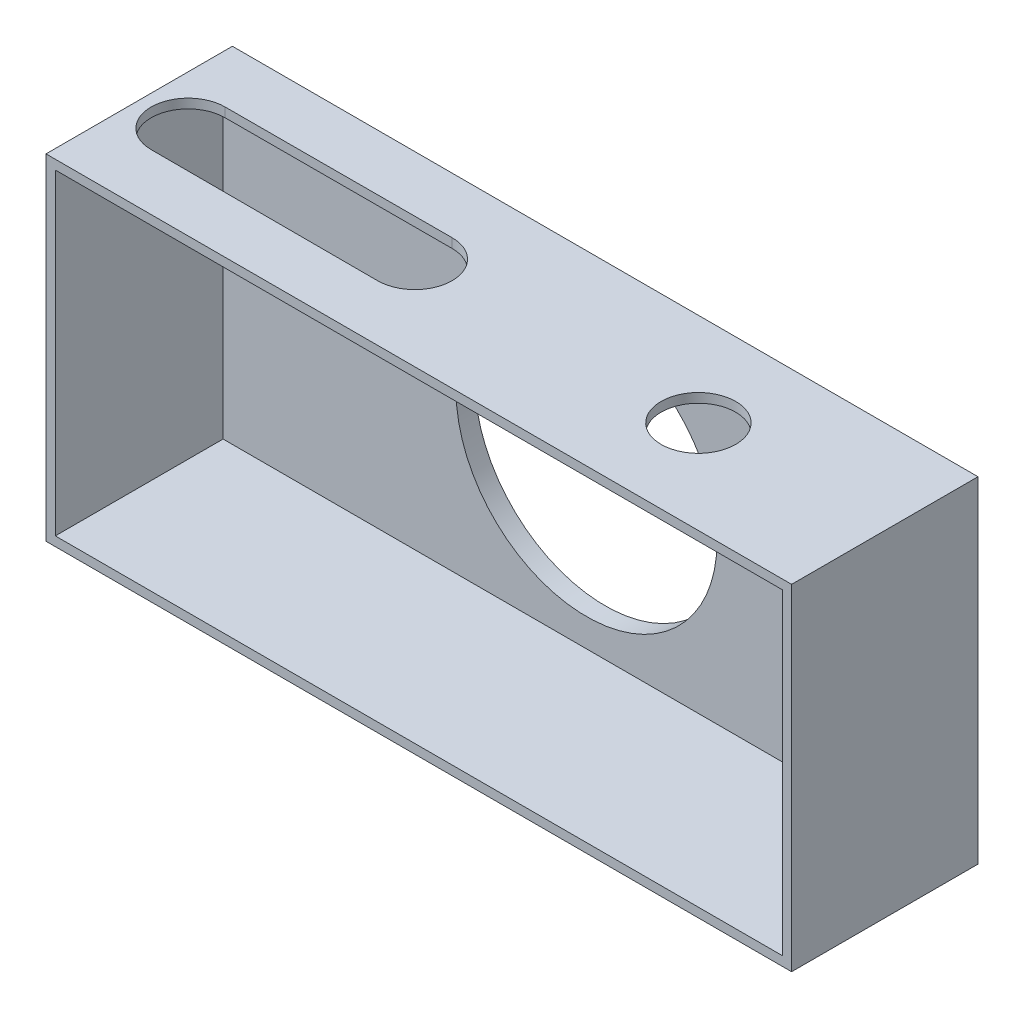
ISO-10303-21;
HEADER;
FILE_DESCRIPTION(('STEP AP214'),'2;1');
FILE_NAME('part.step','',(''),(''),'','','');
FILE_SCHEMA(('AUTOMOTIVE_DESIGN { 1 0 10303 214 1 1 1 1 }'));
ENDSEC;
DATA;
#1=APPLICATION_CONTEXT('core data for automotive mechanical design processes');
#2=APPLICATION_PROTOCOL_DEFINITION('international standard','automotive_design',2000,#1);
#3=PRODUCT_CONTEXT('',#1,'mechanical');
#4=PRODUCT('Part','Part','',(#3));
#5=PRODUCT_RELATED_PRODUCT_CATEGORY('part','',(#4));
#6=PRODUCT_DEFINITION_FORMATION('','',#4);
#7=PRODUCT_DEFINITION_CONTEXT('part definition',#1,'design');
#8=PRODUCT_DEFINITION('design','',#6,#7);
#9=PRODUCT_DEFINITION_SHAPE('','',#8);
#10=(LENGTH_UNIT() NAMED_UNIT(*) SI_UNIT(.MILLI.,.METRE.));
#11=(NAMED_UNIT(*) PLANE_ANGLE_UNIT() SI_UNIT($,.RADIAN.));
#12=(NAMED_UNIT(*) SI_UNIT($,.STERADIAN.) SOLID_ANGLE_UNIT());
#13=UNCERTAINTY_MEASURE_WITH_UNIT(LENGTH_MEASURE(1.E-05),#10,'distance_accuracy_value','');
#14=(GEOMETRIC_REPRESENTATION_CONTEXT(3) GLOBAL_UNCERTAINTY_ASSIGNED_CONTEXT((#13)) GLOBAL_UNIT_ASSIGNED_CONTEXT((#10,
#11,#12)) REPRESENTATION_CONTEXT('',''));
#15=CARTESIAN_POINT('',(0.,0.,0.));
#16=DIRECTION('',(0.,0.,1.));
#17=DIRECTION('',(1.,0.,0.));
#18=AXIS2_PLACEMENT_3D('',#15,#16,#17);
#19=CARTESIAN_POINT('',(0.,0.,127.));
#20=DIRECTION('',(0.,-1.,0.));
#21=DIRECTION('',(1.,0.,0.));
#22=AXIS2_PLACEMENT_3D('',#19,#20,#21);
#23=PLANE('',#22);
#24=DIRECTION('',(-1.,0.,0.));
#25=VECTOR('',#24,1.);
#26=CARTESIAN_POINT('',(0.,0.,0.));
#27=LINE('',#26,#25);
#28=CARTESIAN_POINT('',(0.,0.,0.));
#29=VERTEX_POINT('',#28);
#30=CARTESIAN_POINT('',(-508.,0.,0.));
#31=VERTEX_POINT('',#30);
#32=EDGE_CURVE('E232',#29,#31,#27,.T.);
#33=ORIENTED_EDGE('',*,*,#32,.T.);
#34=DIRECTION('',(0.,0.,-1.));
#35=VECTOR('',#34,1.);
#36=CARTESIAN_POINT('',(-508.,0.,127.));
#37=LINE('',#36,#35);
#38=CARTESIAN_POINT('',(-508.,0.,127.));
#39=VERTEX_POINT('',#38);
#40=EDGE_CURVE('E247',#39,#31,#37,.T.);
#41=ORIENTED_EDGE('',*,*,#40,.F.);
#42=DIRECTION('',(-1.,0.,0.));
#43=VECTOR('',#42,1.);
#44=CARTESIAN_POINT('',(0.,0.,127.));
#45=LINE('',#44,#43);
#46=CARTESIAN_POINT('',(0.,0.,127.));
#47=VERTEX_POINT('',#46);
#48=EDGE_CURVE('E218',#47,#39,#45,.T.);
#49=ORIENTED_EDGE('',*,*,#48,.F.);
#50=DIRECTION('',(0.,0.,-1.));
#51=VECTOR('',#50,1.);
#52=CARTESIAN_POINT('',(0.,0.,127.));
#53=LINE('',#52,#51);
#54=EDGE_CURVE('E251',#47,#29,#53,.T.);
#55=ORIENTED_EDGE('',*,*,#54,.T.);
#56=EDGE_LOOP('',(#33,#41,#49,#55));
#57=FACE_BOUND('',#56,.T.);
#58=CARTESIAN_POINT('',(-127.,0.,63.5));
#59=DIRECTION('',(0.,1.,0.));
#60=DIRECTION('',(0.,0.,1.));
#61=AXIS2_PLACEMENT_3D('',#58,#59,#60);
#62=CIRCLE('',#61,25.4);
#63=CARTESIAN_POINT('',(-127.,0.,88.9));
#64=VERTEX_POINT('',#63);
#65=EDGE_CURVE('E162',#64,#64,#62,.T.);
#66=ORIENTED_EDGE('',*,*,#65,.F.);
#67=EDGE_LOOP('',(#66));
#68=FACE_BOUND('',#67,.T.);
#69=DIRECTION('',(-0.999999143713304,0.,-0.00130865299402516));
#70=VECTOR('',#69,1.);
#71=CARTESIAN_POINT('',(-0.116871006548326,0.,89.3062614817129));
#72=LINE('',#71,#70);
#73=CARTESIAN_POINT('',(-320.168483958783,0.,88.887424621536));
#74=VERTEX_POINT('',#73);
#75=CARTESIAN_POINT('',(-474.665471547515,0.,88.6852415030334));
#76=VERTEX_POINT('',#75);
#77=EDGE_CURVE('E55',#74,#76,#72,.T.);
#78=ORIENTED_EDGE('',*,*,#77,.T.);
#79=CARTESIAN_POINT('',(-474.665471547515,0.,63.5));
#80=DIRECTION('',(0.,1.,0.));
#81=DIRECTION('',(0.,0.,1.));
#82=AXIS2_PLACEMENT_3D('',#79,#80,#81);
#83=CIRCLE('',#82,25.1852415030334);
#84=CARTESIAN_POINT('',(-474.665471547515,0.,38.3147584969666));
#85=VERTEX_POINT('',#84);
#86=EDGE_CURVE('E147',#85,#76,#83,.T.);
#87=ORIENTED_EDGE('',*,*,#86,.F.);
#88=DIRECTION('',(0.999999143713304,0.,-0.00130865299402512));
#89=VECTOR('',#88,1.);
#90=CARTESIAN_POINT('',(0.0493277813789354,0.,37.6935210215594));
#91=LINE('',#90,#89);
#92=CARTESIAN_POINT('',(-320.168483958783,0.,38.112575378464));
#93=VERTEX_POINT('',#92);
#94=EDGE_CURVE('E131',#85,#93,#91,.T.);
#95=ORIENTED_EDGE('',*,*,#94,.T.);
#96=CARTESIAN_POINT('',(-320.168483958783,0.,63.5));
#97=DIRECTION('',(0.,1.,0.));
#98=DIRECTION('',(0.,0.,1.));
#99=AXIS2_PLACEMENT_3D('',#96,#97,#98);
#100=CIRCLE('',#99,25.387424621536);
#101=EDGE_CURVE('E141',#74,#93,#100,.T.);
#102=ORIENTED_EDGE('',*,*,#101,.F.);
#103=EDGE_LOOP('',(#78,#87,#95,#102));
#104=FACE_BOUND('',#103,.T.);
#105=ADVANCED_FACE('F39',(#57,#68,#104),#23,.F.);
#106=CARTESIAN_POINT('',(0.,-6.34999999999999,12.7));
#107=DIRECTION('',(0.,1.,0.));
#108=DIRECTION('',(-1.,0.,0.));
#109=AXIS2_PLACEMENT_3D('',#106,#107,#108);
#110=PLANE('',#109);
#111=DIRECTION('',(-1.,0.,0.));
#112=VECTOR('',#111,1.);
#113=CARTESIAN_POINT('',(0.,-6.34999999999999,127.));
#114=LINE('',#113,#112);
#115=CARTESIAN_POINT('',(-6.35000000000002,-6.34999999999999,127.));
#116=VERTEX_POINT('',#115);
#117=CARTESIAN_POINT('',(-501.65,-6.35000000000005,127.));
#118=VERTEX_POINT('',#117);
#119=EDGE_CURVE('E190',#116,#118,#114,.T.);
#120=ORIENTED_EDGE('',*,*,#119,.T.);
#121=DIRECTION('',(0.,0.,1.));
#122=VECTOR('',#121,1.);
#123=CARTESIAN_POINT('',(-501.65,-6.35000000000005,12.7));
#124=LINE('',#123,#122);
#125=CARTESIAN_POINT('',(-501.65,-6.35000000000005,12.7));
#126=VERTEX_POINT('',#125);
#127=EDGE_CURVE('E208',#126,#118,#124,.T.);
#128=ORIENTED_EDGE('',*,*,#127,.F.);
#129=DIRECTION('',(-1.,0.,0.));
#130=VECTOR('',#129,1.);
#131=CARTESIAN_POINT('',(0.,-6.34999999999999,12.7));
#132=LINE('',#131,#130);
#133=CARTESIAN_POINT('',(-6.35000000000002,-6.34999999999999,12.7));
#134=VERTEX_POINT('',#133);
#135=EDGE_CURVE('E176',#134,#126,#132,.T.);
#136=ORIENTED_EDGE('',*,*,#135,.F.);
#137=DIRECTION('',(0.,0.,1.));
#138=VECTOR('',#137,1.);
#139=CARTESIAN_POINT('',(-6.35000000000002,-6.34999999999999,12.7));
#140=LINE('',#139,#138);
#141=EDGE_CURVE('E187',#134,#116,#140,.T.);
#142=ORIENTED_EDGE('',*,*,#141,.T.);
#143=EDGE_LOOP('',(#120,#128,#136,#142));
#144=FACE_BOUND('',#143,.T.);
#145=CARTESIAN_POINT('',(-127.,-6.35000000000002,63.5));
#146=DIRECTION('',(0.,1.,0.));
#147=DIRECTION('',(-1.,0.,0.));
#148=AXIS2_PLACEMENT_3D('',#145,#146,#147);
#149=CIRCLE('',#148,25.4);
#150=CARTESIAN_POINT('',(-152.4,-6.35000000000003,63.5));
#151=VERTEX_POINT('',#150);
#152=EDGE_CURVE('E157',#151,#151,#149,.T.);
#153=ORIENTED_EDGE('',*,*,#152,.T.);
#154=EDGE_LOOP('',(#153));
#155=FACE_BOUND('',#154,.T.);
#156=DIRECTION('',(-0.999999143713304,0.,-0.00130865299402516));
#157=VECTOR('',#156,1.);
#158=CARTESIAN_POINT('',(-0.100251127755599,-6.34999999999999,89.3062832313857));
#159=LINE('',#158,#157);
#160=CARTESIAN_POINT('',(-320.168483958783,-6.35000000000002,88.887424621536));
#161=VERTEX_POINT('',#160);
#162=CARTESIAN_POINT('',(-474.665471547515,-6.35000000000005,88.6852415030334));
#163=VERTEX_POINT('',#162);
#164=EDGE_CURVE('E11',#161,#163,#159,.T.);
#165=ORIENTED_EDGE('',*,*,#164,.F.);
#166=CARTESIAN_POINT('',(-320.168483958783,-6.35000000000002,63.5));
#167=DIRECTION('',(0.,1.,0.));
#168=DIRECTION('',(-1.,0.,0.));
#169=AXIS2_PLACEMENT_3D('',#166,#167,#168);
#170=CIRCLE('',#169,25.387424621536);
#171=CARTESIAN_POINT('',(-320.168483958783,-6.35000000000002,38.112575378464));
#172=VERTEX_POINT('',#171);
#173=EDGE_CURVE('E255',#161,#172,#170,.T.);
#174=ORIENTED_EDGE('',*,*,#173,.T.);
#175=DIRECTION('',(0.999999143713304,0.,-0.00130865299402512));
#176=VECTOR('',#175,1.);
#177=CARTESIAN_POINT('',(0.0327079025862104,-6.34999999999999,37.6935427712322));
#178=LINE('',#177,#176);
#179=CARTESIAN_POINT('',(-474.665471547515,-6.35000000000002,38.3147584969666));
#180=VERTEX_POINT('',#179);
#181=EDGE_CURVE('E134',#180,#172,#178,.T.);
#182=ORIENTED_EDGE('',*,*,#181,.F.);
#183=CARTESIAN_POINT('',(-474.665471547515,-6.35000000000005,63.5));
#184=DIRECTION('',(0.,1.,0.));
#185=DIRECTION('',(-1.,0.,0.));
#186=AXIS2_PLACEMENT_3D('',#183,#184,#185);
#187=CIRCLE('',#186,25.1852415030334);
#188=EDGE_CURVE('E48',#180,#163,#187,.T.);
#189=ORIENTED_EDGE('',*,*,#188,.T.);
#190=EDGE_LOOP('',(#165,#174,#182,#189));
#191=FACE_BOUND('',#190,.T.);
#192=ADVANCED_FACE('F269',(#144,#155,#191),#110,.F.);
#193=CARTESIAN_POINT('',(0.,0.,127.));
#194=DIRECTION('',(-1.,0.,0.));
#195=DIRECTION('',(0.,0.,1.));
#196=AXIS2_PLACEMENT_3D('',#193,#194,#195);
#197=PLANE('',#196);
#198=DIRECTION('',(0.,1.,0.));
#199=VECTOR('',#198,1.);
#200=CARTESIAN_POINT('',(0.,0.,0.));
#201=LINE('',#200,#199);
#202=CARTESIAN_POINT('',(0.,-228.6,0.));
#203=VERTEX_POINT('',#202);
#204=EDGE_CURVE('E204',#203,#29,#201,.T.);
#205=ORIENTED_EDGE('',*,*,#204,.T.);
#206=ORIENTED_EDGE('',*,*,#54,.F.);
#207=DIRECTION('',(0.,1.,0.));
#208=VECTOR('',#207,1.);
#209=CARTESIAN_POINT('',(0.,0.,127.));
#210=LINE('',#209,#208);
#211=CARTESIAN_POINT('',(0.,-228.6,127.));
#212=VERTEX_POINT('',#211);
#213=EDGE_CURVE('E214',#212,#47,#210,.T.);
#214=ORIENTED_EDGE('',*,*,#213,.F.);
#215=DIRECTION('',(0.,0.,-1.));
#216=VECTOR('',#215,1.);
#217=CARTESIAN_POINT('',(0.,-228.6,127.));
#218=LINE('',#217,#216);
#219=EDGE_CURVE('E228',#212,#203,#218,.T.);
#220=ORIENTED_EDGE('',*,*,#219,.T.);
#221=EDGE_LOOP('',(#205,#206,#214,#220));
#222=FACE_BOUND('',#221,.T.);
#223=ADVANCED_FACE('F41',(#222),#197,.F.);
#224=CARTESIAN_POINT('',(-508.,0.,127.));
#225=DIRECTION('',(1.,0.,0.));
#226=DIRECTION('',(0.,0.,-1.));
#227=AXIS2_PLACEMENT_3D('',#224,#225,#226);
#228=PLANE('',#227);
#229=DIRECTION('',(0.,-1.,0.));
#230=VECTOR('',#229,1.);
#231=CARTESIAN_POINT('',(-508.,0.,0.));
#232=LINE('',#231,#230);
#233=CARTESIAN_POINT('',(-508.,-228.6,0.));
#234=VERTEX_POINT('',#233);
#235=EDGE_CURVE('E235',#31,#234,#232,.T.);
#236=ORIENTED_EDGE('',*,*,#235,.T.);
#237=DIRECTION('',(0.,0.,-1.));
#238=VECTOR('',#237,1.);
#239=CARTESIAN_POINT('',(-508.,-228.6,127.));
#240=LINE('',#239,#238);
#241=CARTESIAN_POINT('',(-508.,-228.6,127.));
#242=VERTEX_POINT('',#241);
#243=EDGE_CURVE('E243',#242,#234,#240,.T.);
#244=ORIENTED_EDGE('',*,*,#243,.F.);
#245=DIRECTION('',(0.,-1.,0.));
#246=VECTOR('',#245,1.);
#247=CARTESIAN_POINT('',(-508.,0.,127.));
#248=LINE('',#247,#246);
#249=EDGE_CURVE('E222',#39,#242,#248,.T.);
#250=ORIENTED_EDGE('',*,*,#249,.F.);
#251=ORIENTED_EDGE('',*,*,#40,.T.);
#252=EDGE_LOOP('',(#236,#244,#250,#251));
#253=FACE_BOUND('',#252,.T.);
#254=ADVANCED_FACE('F295',(#253),#228,.F.);
#255=CARTESIAN_POINT('',(0.,-228.6,127.));
#256=DIRECTION('',(0.,1.,0.));
#257=DIRECTION('',(-1.,0.,0.));
#258=AXIS2_PLACEMENT_3D('',#255,#256,#257);
#259=PLANE('',#258);
#260=DIRECTION('',(1.,0.,0.));
#261=VECTOR('',#260,1.);
#262=CARTESIAN_POINT('',(0.,-228.6,0.));
#263=LINE('',#262,#261);
#264=EDGE_CURVE('E219',#234,#203,#263,.T.);
#265=ORIENTED_EDGE('',*,*,#264,.T.);
#266=ORIENTED_EDGE('',*,*,#219,.F.);
#267=DIRECTION('',(1.,0.,0.));
#268=VECTOR('',#267,1.);
#269=CARTESIAN_POINT('',(0.,-228.6,127.));
#270=LINE('',#269,#268);
#271=EDGE_CURVE('E225',#242,#212,#270,.T.);
#272=ORIENTED_EDGE('',*,*,#271,.F.);
#273=ORIENTED_EDGE('',*,*,#243,.T.);
#274=EDGE_LOOP('',(#265,#266,#272,#273));
#275=FACE_BOUND('',#274,.T.);
#276=ADVANCED_FACE('F298',(#275),#259,.F.);
#277=CARTESIAN_POINT('',(0.,0.,127.));
#278=DIRECTION('',(0.,0.,-1.));
#279=DIRECTION('',(-1.,0.,0.));
#280=AXIS2_PLACEMENT_3D('',#277,#278,#279);
#281=PLANE('',#280);
#282=ORIENTED_EDGE('',*,*,#119,.F.);
#283=DIRECTION('',(0.,1.,0.));
#284=VECTOR('',#283,1.);
#285=CARTESIAN_POINT('',(-6.35000000000002,0.,127.));
#286=LINE('',#285,#284);
#287=CARTESIAN_POINT('',(-6.35000000000002,-222.25,127.));
#288=VERTEX_POINT('',#287);
#289=EDGE_CURVE('E170',#288,#116,#286,.T.);
#290=ORIENTED_EDGE('',*,*,#289,.F.);
#291=DIRECTION('',(-1.,0.,0.));
#292=VECTOR('',#291,1.);
#293=CARTESIAN_POINT('',(0.,-222.25,127.));
#294=LINE('',#293,#292);
#295=CARTESIAN_POINT('',(-501.65,-222.25,127.));
#296=VERTEX_POINT('',#295);
#297=EDGE_CURVE('E177',#288,#296,#294,.T.);
#298=ORIENTED_EDGE('',*,*,#297,.T.);
#299=DIRECTION('',(0.,1.,0.));
#300=VECTOR('',#299,1.);
#301=CARTESIAN_POINT('',(-501.65,0.,127.));
#302=LINE('',#301,#300);
#303=EDGE_CURVE('E194',#296,#118,#302,.T.);
#304=ORIENTED_EDGE('',*,*,#303,.T.);
#305=EDGE_LOOP('',(#282,#290,#298,#304));
#306=FACE_BOUND('',#305,.T.);
#307=ORIENTED_EDGE('',*,*,#213,.T.);
#308=ORIENTED_EDGE('',*,*,#48,.T.);
#309=ORIENTED_EDGE('',*,*,#249,.T.);
#310=ORIENTED_EDGE('',*,*,#271,.T.);
#311=EDGE_LOOP('',(#307,#308,#309,#310));
#312=FACE_BOUND('',#311,.T.);
#313=ADVANCED_FACE('F302',(#306,#312),#281,.F.);
#314=CARTESIAN_POINT('',(0.,0.,0.));
#315=DIRECTION('',(0.,0.,-1.));
#316=DIRECTION('',(-1.,0.,0.));
#317=AXIS2_PLACEMENT_3D('',#314,#315,#316);
#318=PLANE('',#317);
#319=CARTESIAN_POINT('',(-254.,-114.3,0.));
#320=DIRECTION('',(0.,0.,-1.));
#321=DIRECTION('',(-1.,0.,0.));
#322=AXIS2_PLACEMENT_3D('',#319,#320,#321);
#323=CIRCLE('',#322,88.9);
#324=CARTESIAN_POINT('',(-342.9,-114.3,0.));
#325=VERTEX_POINT('',#324);
#326=EDGE_CURVE('E166',#325,#325,#323,.T.);
#327=ORIENTED_EDGE('',*,*,#326,.F.);
#328=EDGE_LOOP('',(#327));
#329=FACE_BOUND('',#328,.T.);
#330=ORIENTED_EDGE('',*,*,#204,.F.);
#331=ORIENTED_EDGE('',*,*,#264,.F.);
#332=ORIENTED_EDGE('',*,*,#235,.F.);
#333=ORIENTED_EDGE('',*,*,#32,.F.);
#334=EDGE_LOOP('',(#330,#331,#332,#333));
#335=FACE_BOUND('',#334,.T.);
#336=ADVANCED_FACE('F304',(#329,#335),#318,.T.);
#337=CARTESIAN_POINT('',(-6.35000000000002,0.,12.7));
#338=DIRECTION('',(1.,0.,0.));
#339=DIRECTION('',(0.,0.,-1.));
#340=AXIS2_PLACEMENT_3D('',#337,#338,#339);
#341=PLANE('',#340);
#342=ORIENTED_EDGE('',*,*,#289,.T.);
#343=ORIENTED_EDGE('',*,*,#141,.F.);
#344=DIRECTION('',(0.,1.,0.));
#345=VECTOR('',#344,1.);
#346=CARTESIAN_POINT('',(-6.35000000000002,0.,12.7));
#347=LINE('',#346,#345);
#348=CARTESIAN_POINT('',(-6.35000000000002,-222.25,12.7));
#349=VERTEX_POINT('',#348);
#350=EDGE_CURVE('E172',#349,#134,#347,.T.);
#351=ORIENTED_EDGE('',*,*,#350,.F.);
#352=DIRECTION('',(0.,0.,1.));
#353=VECTOR('',#352,1.);
#354=CARTESIAN_POINT('',(-6.35000000000002,-222.25,12.7));
#355=LINE('',#354,#353);
#356=EDGE_CURVE('E201',#349,#288,#355,.T.);
#357=ORIENTED_EDGE('',*,*,#356,.T.);
#358=EDGE_LOOP('',(#342,#343,#351,#357));
#359=FACE_BOUND('',#358,.T.);
#360=ADVANCED_FACE('F307',(#359),#341,.F.);
#361=CARTESIAN_POINT('',(0.,-222.25,12.7));
#362=DIRECTION('',(0.,1.,0.));
#363=DIRECTION('',(-1.,0.,0.));
#364=AXIS2_PLACEMENT_3D('',#361,#362,#363);
#365=PLANE('',#364);
#366=ORIENTED_EDGE('',*,*,#297,.F.);
#367=ORIENTED_EDGE('',*,*,#356,.F.);
#368=DIRECTION('',(-1.,0.,0.));
#369=VECTOR('',#368,1.);
#370=CARTESIAN_POINT('',(0.,-222.25,12.7));
#371=LINE('',#370,#369);
#372=CARTESIAN_POINT('',(-501.65,-222.25,12.7));
#373=VERTEX_POINT('',#372);
#374=EDGE_CURVE('E184',#349,#373,#371,.T.);
#375=ORIENTED_EDGE('',*,*,#374,.T.);
#376=DIRECTION('',(0.,0.,1.));
#377=VECTOR('',#376,1.);
#378=CARTESIAN_POINT('',(-501.65,-222.25,12.7));
#379=LINE('',#378,#377);
#380=EDGE_CURVE('E205',#373,#296,#379,.T.);
#381=ORIENTED_EDGE('',*,*,#380,.T.);
#382=EDGE_LOOP('',(#366,#367,#375,#381));
#383=FACE_BOUND('',#382,.T.);
#384=ADVANCED_FACE('F313',(#383),#365,.T.);
#385=CARTESIAN_POINT('',(-501.65,0.,12.7));
#386=DIRECTION('',(1.,0.,0.));
#387=DIRECTION('',(0.,0.,-1.));
#388=AXIS2_PLACEMENT_3D('',#385,#386,#387);
#389=PLANE('',#388);
#390=ORIENTED_EDGE('',*,*,#303,.F.);
#391=ORIENTED_EDGE('',*,*,#380,.F.);
#392=DIRECTION('',(0.,1.,0.));
#393=VECTOR('',#392,1.);
#394=CARTESIAN_POINT('',(-501.65,0.,12.7));
#395=LINE('',#394,#393);
#396=EDGE_CURVE('E181',#373,#126,#395,.T.);
#397=ORIENTED_EDGE('',*,*,#396,.T.);
#398=ORIENTED_EDGE('',*,*,#127,.T.);
#399=EDGE_LOOP('',(#390,#391,#397,#398));
#400=FACE_BOUND('',#399,.T.);
#401=ADVANCED_FACE('F316',(#400),#389,.T.);
#402=CARTESIAN_POINT('',(0.,0.,12.7));
#403=DIRECTION('',(0.,0.,1.));
#404=DIRECTION('',(1.,0.,0.));
#405=AXIS2_PLACEMENT_3D('',#402,#403,#404);
#406=PLANE('',#405);
#407=CARTESIAN_POINT('',(-254.,-114.3,12.7));
#408=DIRECTION('',(0.,0.,1.));
#409=DIRECTION('',(1.,0.,0.));
#410=AXIS2_PLACEMENT_3D('',#407,#408,#409);
#411=CIRCLE('',#410,88.9);
#412=CARTESIAN_POINT('',(-165.1,-114.3,12.7));
#413=VERTEX_POINT('',#412);
#414=EDGE_CURVE('E171',#413,#413,#411,.T.);
#415=ORIENTED_EDGE('',*,*,#414,.F.);
#416=EDGE_LOOP('',(#415));
#417=FACE_BOUND('',#416,.T.);
#418=ORIENTED_EDGE('',*,*,#350,.T.);
#419=ORIENTED_EDGE('',*,*,#135,.T.);
#420=ORIENTED_EDGE('',*,*,#396,.F.);
#421=ORIENTED_EDGE('',*,*,#374,.F.);
#422=EDGE_LOOP('',(#418,#419,#420,#421));
#423=FACE_BOUND('',#422,.T.);
#424=ADVANCED_FACE('F319',(#417,#423),#406,.T.);
#425=CARTESIAN_POINT('',(-254.,-114.3,-30.988));
#426=DIRECTION('',(0.,0.,1.));
#427=DIRECTION('',(1.,0.,0.));
#428=AXIS2_PLACEMENT_3D('',#425,#426,#427);
#429=CYLINDRICAL_SURFACE('',#428,88.9);
#430=ORIENTED_EDGE('',*,*,#326,.T.);
#431=EDGE_LOOP('',(#430));
#432=FACE_BOUND('',#431,.T.);
#433=ORIENTED_EDGE('',*,*,#414,.T.);
#434=EDGE_LOOP('',(#433));
#435=FACE_BOUND('',#434,.T.);
#436=ADVANCED_FACE('F282',(#432,#435),#429,.F.);
#437=CARTESIAN_POINT('',(-127.,-157.988,63.5));
#438=DIRECTION('',(0.,1.,0.));
#439=DIRECTION('',(0.,0.,1.));
#440=AXIS2_PLACEMENT_3D('',#437,#438,#439);
#441=CYLINDRICAL_SURFACE('',#440,25.4);
#442=ORIENTED_EDGE('',*,*,#65,.T.);
#443=EDGE_LOOP('',(#442));
#444=FACE_BOUND('',#443,.T.);
#445=ORIENTED_EDGE('',*,*,#152,.F.);
#446=EDGE_LOOP('',(#445));
#447=FACE_BOUND('',#446,.T.);
#448=ADVANCED_FACE('F275',(#444,#447),#441,.F.);
#449=CARTESIAN_POINT('',(-0.116871006548326,-157.988,89.3062614817129));
#450=DIRECTION('',(0.00130865299402516,0.,-0.999999143713304));
#451=DIRECTION('',(-0.999999143713304,0.,-0.00130865299402516));
#452=AXIS2_PLACEMENT_3D('',#449,#450,#451);
#453=PLANE('',#452);
#454=ORIENTED_EDGE('',*,*,#164,.T.);
#455=DIRECTION('',(0.,1.,0.));
#456=VECTOR('',#455,1.);
#457=CARTESIAN_POINT('',(-474.665471547515,-157.988,88.6852415030334));
#458=LINE('',#457,#456);
#459=EDGE_CURVE('E154',#163,#76,#458,.T.);
#460=ORIENTED_EDGE('',*,*,#459,.T.);
#461=ORIENTED_EDGE('',*,*,#77,.F.);
#462=DIRECTION('',(0.,1.,0.));
#463=VECTOR('',#462,1.);
#464=CARTESIAN_POINT('',(-320.168483958783,-157.988,88.887424621536));
#465=LINE('',#464,#463);
#466=EDGE_CURVE('E138',#161,#74,#465,.T.);
#467=ORIENTED_EDGE('',*,*,#466,.F.);
#468=EDGE_LOOP('',(#454,#460,#461,#467));
#469=FACE_BOUND('',#468,.T.);
#470=ADVANCED_FACE('F273',(#469),#453,.T.);
#471=CARTESIAN_POINT('',(-474.665471547515,-157.988,63.5));
#472=DIRECTION('',(0.,1.,0.));
#473=DIRECTION('',(0.,0.,1.));
#474=AXIS2_PLACEMENT_3D('',#471,#472,#473);
#475=CYLINDRICAL_SURFACE('',#474,25.1852415030334);
#476=DIRECTION('',(0.,1.,0.));
#477=VECTOR('',#476,1.);
#478=CARTESIAN_POINT('',(-474.665471547515,-157.988,38.3147584969666));
#479=LINE('',#478,#477);
#480=EDGE_CURVE('E137',#180,#85,#479,.T.);
#481=ORIENTED_EDGE('',*,*,#480,.T.);
#482=ORIENTED_EDGE('',*,*,#86,.T.);
#483=ORIENTED_EDGE('',*,*,#459,.F.);
#484=ORIENTED_EDGE('',*,*,#188,.F.);
#485=EDGE_LOOP('',(#481,#482,#483,#484));
#486=FACE_BOUND('',#485,.T.);
#487=ADVANCED_FACE('F272',(#486),#475,.F.);
#488=CARTESIAN_POINT('',(0.0493277813789354,-157.988,37.6935210215594));
#489=DIRECTION('',(0.00130865299402512,0.,0.999999143713304));
#490=DIRECTION('',(0.999999143713304,0.,-0.00130865299402512));
#491=AXIS2_PLACEMENT_3D('',#488,#489,#490);
#492=PLANE('',#491);
#493=ORIENTED_EDGE('',*,*,#181,.T.);
#494=DIRECTION('',(0.,1.,0.));
#495=VECTOR('',#494,1.);
#496=CARTESIAN_POINT('',(-320.168483958783,-157.988,38.112575378464));
#497=LINE('',#496,#495);
#498=EDGE_CURVE('E63',#172,#93,#497,.T.);
#499=ORIENTED_EDGE('',*,*,#498,.T.);
#500=ORIENTED_EDGE('',*,*,#94,.F.);
#501=ORIENTED_EDGE('',*,*,#480,.F.);
#502=EDGE_LOOP('',(#493,#499,#500,#501));
#503=FACE_BOUND('',#502,.T.);
#504=ADVANCED_FACE('F128',(#503),#492,.T.);
#505=CARTESIAN_POINT('',(-320.168483958783,-157.988,63.5));
#506=DIRECTION('',(0.,1.,0.));
#507=DIRECTION('',(0.,0.,1.));
#508=AXIS2_PLACEMENT_3D('',#505,#506,#507);
#509=CYLINDRICAL_SURFACE('',#508,25.387424621536);
#510=ORIENTED_EDGE('',*,*,#466,.T.);
#511=ORIENTED_EDGE('',*,*,#101,.T.);
#512=ORIENTED_EDGE('',*,*,#498,.F.);
#513=ORIENTED_EDGE('',*,*,#173,.F.);
#514=EDGE_LOOP('',(#510,#511,#512,#513));
#515=FACE_BOUND('',#514,.T.);
#516=ADVANCED_FACE('F142',(#515),#509,.F.);
#517=CLOSED_SHELL('',(#105,#192,#223,#254,#276,#313,#336,#360,#384,#401,#424,#436,#448,#470,
#487,#504,#516));
#518=MANIFOLD_SOLID_BREP('B2',#517);
#519=ADVANCED_BREP_SHAPE_REPRESENTATION('',(#18,#518),#14);
#520=SHAPE_DEFINITION_REPRESENTATION(#9,#519);
ENDSEC;
END-ISO-10303-21;
